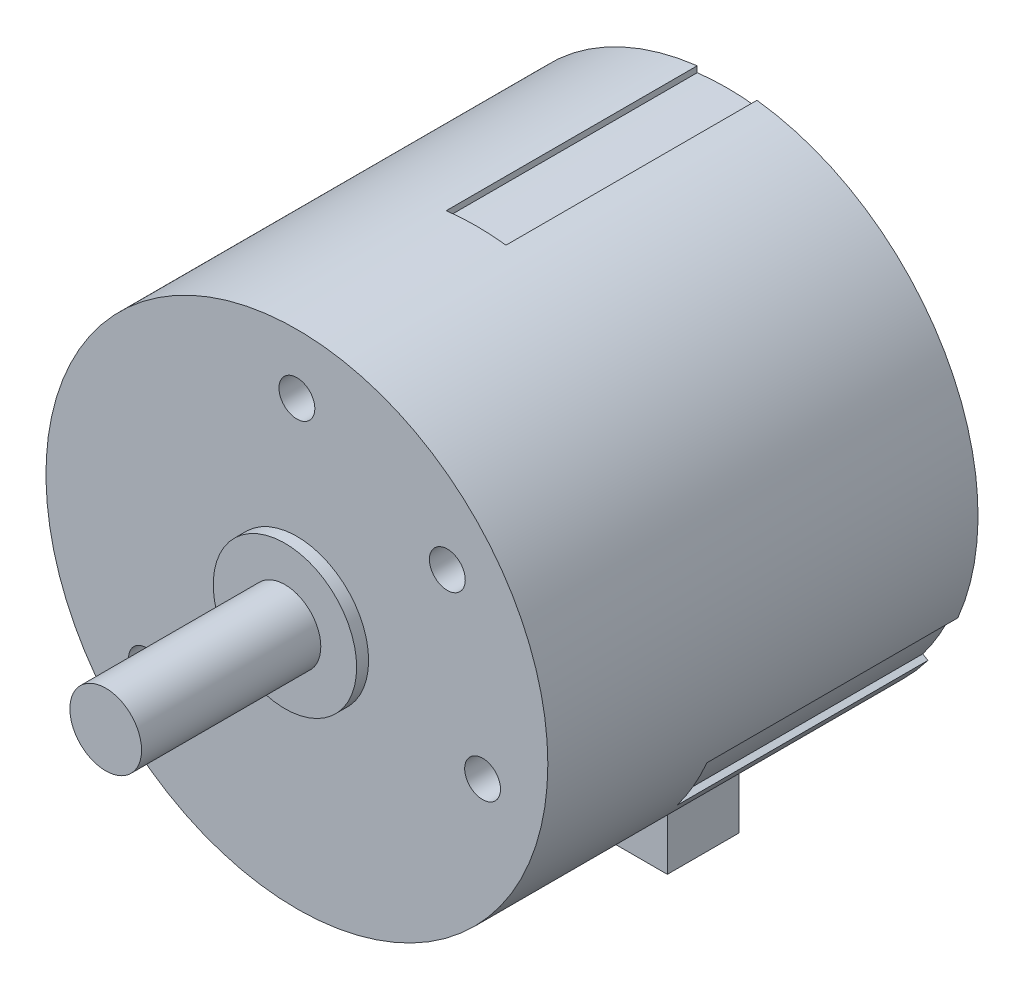
ISO-10303-21;
HEADER;
FILE_DESCRIPTION(('STEP AP214'),'2;1');
FILE_NAME('part.step','',(''),(''),'','','');
FILE_SCHEMA(('AUTOMOTIVE_DESIGN { 1 0 10303 214 1 1 1 1 }'));
ENDSEC;
DATA;
#1=APPLICATION_CONTEXT('core data for automotive mechanical design processes');
#2=APPLICATION_PROTOCOL_DEFINITION('international standard','automotive_design',2000,#1);
#3=PRODUCT_CONTEXT('',#1,'mechanical');
#4=PRODUCT('Part','Part','',(#3));
#5=PRODUCT_RELATED_PRODUCT_CATEGORY('part','',(#4));
#6=PRODUCT_DEFINITION_FORMATION('','',#4);
#7=PRODUCT_DEFINITION_CONTEXT('part definition',#1,'design');
#8=PRODUCT_DEFINITION('design','',#6,#7);
#9=PRODUCT_DEFINITION_SHAPE('','',#8);
#10=(LENGTH_UNIT() NAMED_UNIT(*) SI_UNIT(.MILLI.,.METRE.));
#11=(NAMED_UNIT(*) PLANE_ANGLE_UNIT() SI_UNIT($,.RADIAN.));
#12=(NAMED_UNIT(*) SI_UNIT($,.STERADIAN.) SOLID_ANGLE_UNIT());
#13=UNCERTAINTY_MEASURE_WITH_UNIT(LENGTH_MEASURE(1.E-05),#10,'distance_accuracy_value','');
#14=(GEOMETRIC_REPRESENTATION_CONTEXT(3) GLOBAL_UNCERTAINTY_ASSIGNED_CONTEXT((#13)) GLOBAL_UNIT_ASSIGNED_CONTEXT((#10,
#11,#12)) REPRESENTATION_CONTEXT('',''));
#15=CARTESIAN_POINT('',(0.,0.,0.));
#16=DIRECTION('',(0.,0.,1.));
#17=DIRECTION('',(1.,0.,0.));
#18=AXIS2_PLACEMENT_3D('',#15,#16,#17);
#19=CARTESIAN_POINT('',(0.,0.,0.));
#20=DIRECTION('',(0.,0.,1.));
#21=DIRECTION('',(1.,0.,0.));
#22=AXIS2_PLACEMENT_3D('',#19,#20,#21);
#23=PLANE('',#22);
#24=DIRECTION('',(-0.866025403784439,-0.499999999999999,0.));
#25=VECTOR('',#24,1.);
#26=CARTESIAN_POINT('',(-19.3072007797444,-8.26026622153542,0.));
#27=LINE('',#26,#25);
#28=CARTESIAN_POINT('',(-18.8710101867061,-8.00843146522681,0.));
#29=VERTEX_POINT('',#28);
#30=CARTESIAN_POINT('',(-19.3072007797444,-8.26026622153542,0.));
#31=VERTEX_POINT('',#30);
#32=EDGE_CURVE('E286',#29,#31,#27,.T.);
#33=ORIENTED_EDGE('',*,*,#32,.F.);
#34=CARTESIAN_POINT('',(0.,0.,0.));
#35=DIRECTION('',(0.,0.,-1.));
#36=DIRECTION('',(-1.,0.,0.));
#37=AXIS2_PLACEMENT_3D('',#34,#35,#36);
#38=CIRCLE('',#37,20.5);
#39=CARTESIAN_POINT('',(-16.3710101867061,-12.338558484149,0.));
#40=VERTEX_POINT('',#39);
#41=EDGE_CURVE('E315',#40,#29,#38,.T.);
#42=ORIENTED_EDGE('',*,*,#41,.F.);
#43=DIRECTION('',(0.866025403784439,0.499999999999999,0.));
#44=VECTOR('',#43,1.);
#45=CARTESIAN_POINT('',(-16.8072007797444,-12.5903932404576,0.));
#46=LINE('',#45,#44);
#47=CARTESIAN_POINT('',(-16.8072007797444,-12.5903932404576,0.));
#48=VERTEX_POINT('',#47);
#49=EDGE_CURVE('E312',#48,#40,#46,.T.);
#50=ORIENTED_EDGE('',*,*,#49,.F.);
#51=CARTESIAN_POINT('',(0.,0.,0.));
#52=DIRECTION('',(0.,0.,1.));
#53=DIRECTION('',(1.,0.,0.));
#54=AXIS2_PLACEMENT_3D('',#51,#52,#53);
#55=CIRCLE('',#54,21.);
#56=EDGE_CURVE('E363',#31,#48,#55,.T.);
#57=ORIENTED_EDGE('',*,*,#56,.F.);
#58=EDGE_LOOP('',(#33,#42,#50,#57));
#59=FACE_BOUND('',#58,.T.);
#60=ADVANCED_FACE('F36',(#59),#23,.F.);
#61=DIRECTION('',(0.,-1.,0.));
#62=VECTOR('',#61,1.);
#63=CARTESIAN_POINT('',(-15.,-13.9731886124821,0.));
#64=LINE('',#63,#62);
#65=CARTESIAN_POINT('',(-15.,-13.9731886124821,0.));
#66=VERTEX_POINT('',#65);
#67=CARTESIAN_POINT('',(-15.,-14.6969384566991,0.));
#68=VERTEX_POINT('',#67);
#69=EDGE_CURVE('E309',#66,#68,#64,.T.);
#70=ORIENTED_EDGE('',*,*,#69,.F.);
#71=CARTESIAN_POINT('',(0.,0.,0.));
#72=DIRECTION('',(0.,0.,-1.));
#73=DIRECTION('',(-1.,0.,0.));
#74=AXIS2_PLACEMENT_3D('',#71,#72,#73);
#75=CIRCLE('',#74,20.5);
#76=CARTESIAN_POINT('',(15.,-13.9731886124821,0.));
#77=VERTEX_POINT('',#76);
#78=EDGE_CURVE('E306',#77,#66,#75,.T.);
#79=ORIENTED_EDGE('',*,*,#78,.F.);
#80=DIRECTION('',(0.,1.,0.));
#81=VECTOR('',#80,1.);
#82=CARTESIAN_POINT('',(15.,-13.9731886124821,0.));
#83=LINE('',#82,#81);
#84=CARTESIAN_POINT('',(15.,-14.6969384566991,0.));
#85=VERTEX_POINT('',#84);
#86=EDGE_CURVE('E303',#85,#77,#83,.T.);
#87=ORIENTED_EDGE('',*,*,#86,.F.);
#88=EDGE_CURVE('E365',#68,#85,#55,.T.);
#89=ORIENTED_EDGE('',*,*,#88,.F.);
#90=EDGE_LOOP('',(#70,#79,#87,#89));
#91=FACE_BOUND('',#90,.T.);
#92=ADVANCED_FACE('F386',(#91),#23,.F.);
#93=DIRECTION('',(0.866025403784441,-0.499999999999997,0.));
#94=VECTOR('',#93,1.);
#95=CARTESIAN_POINT('',(16.8072007797443,-12.5903932404576,0.));
#96=LINE('',#95,#94);
#97=CARTESIAN_POINT('',(16.3710101867061,-12.338558484149,0.));
#98=VERTEX_POINT('',#97);
#99=CARTESIAN_POINT('',(16.8072007797443,-12.5903932404576,0.));
#100=VERTEX_POINT('',#99);
#101=EDGE_CURVE('E300',#98,#100,#96,.T.);
#102=ORIENTED_EDGE('',*,*,#101,.F.);
#103=CARTESIAN_POINT('',(0.,0.,0.));
#104=DIRECTION('',(0.,0.,-1.));
#105=DIRECTION('',(-1.,0.,0.));
#106=AXIS2_PLACEMENT_3D('',#103,#104,#105);
#107=CIRCLE('',#106,20.5);
#108=CARTESIAN_POINT('',(18.8710101867061,-8.00843146522682,0.));
#109=VERTEX_POINT('',#108);
#110=EDGE_CURVE('E297',#109,#98,#107,.T.);
#111=ORIENTED_EDGE('',*,*,#110,.F.);
#112=DIRECTION('',(-0.866025403784438,0.500000000000002,0.));
#113=VECTOR('',#112,1.);
#114=CARTESIAN_POINT('',(19.3072007797443,-8.26026622153543,0.));
#115=LINE('',#114,#113);
#116=CARTESIAN_POINT('',(19.3072007797443,-8.26026622153543,0.));
#117=VERTEX_POINT('',#116);
#118=EDGE_CURVE('E294',#117,#109,#115,.T.);
#119=ORIENTED_EDGE('',*,*,#118,.F.);
#120=EDGE_CURVE('E191',#100,#117,#55,.T.);
#121=ORIENTED_EDGE('',*,*,#120,.F.);
#122=EDGE_LOOP('',(#102,#111,#119,#121));
#123=FACE_BOUND('',#122,.T.);
#124=ADVANCED_FACE('F416',(#123),#23,.F.);
#125=DIRECTION('',(0.,1.,0.));
#126=VECTOR('',#125,1.);
#127=CARTESIAN_POINT('',(2.5,20.850659461993,0.));
#128=LINE('',#127,#126);
#129=CARTESIAN_POINT('',(2.5,20.3469899493758,0.));
#130=VERTEX_POINT('',#129);
#131=CARTESIAN_POINT('',(2.5,20.850659461993,0.));
#132=VERTEX_POINT('',#131);
#133=EDGE_CURVE('E291',#130,#132,#128,.T.);
#134=ORIENTED_EDGE('',*,*,#133,.F.);
#135=CARTESIAN_POINT('',(0.,0.,0.));
#136=DIRECTION('',(0.,0.,-1.));
#137=DIRECTION('',(-1.,0.,0.));
#138=AXIS2_PLACEMENT_3D('',#135,#136,#137);
#139=CIRCLE('',#138,20.5);
#140=CARTESIAN_POINT('',(-2.5,20.3469899493758,0.));
#141=VERTEX_POINT('',#140);
#142=EDGE_CURVE('E288',#141,#130,#139,.T.);
#143=ORIENTED_EDGE('',*,*,#142,.F.);
#144=DIRECTION('',(0.,-1.,0.));
#145=VECTOR('',#144,1.);
#146=CARTESIAN_POINT('',(-2.5,20.850659461993,0.));
#147=LINE('',#146,#145);
#148=CARTESIAN_POINT('',(-2.5,20.850659461993,0.));
#149=VERTEX_POINT('',#148);
#150=EDGE_CURVE('E282',#149,#141,#147,.T.);
#151=ORIENTED_EDGE('',*,*,#150,.F.);
#152=EDGE_CURVE('E40',#132,#149,#55,.T.);
#153=ORIENTED_EDGE('',*,*,#152,.F.);
#154=EDGE_LOOP('',(#134,#143,#151,#153));
#155=FACE_BOUND('',#154,.T.);
#156=ADVANCED_FACE('F412',(#155),#23,.F.);
#157=CARTESIAN_POINT('',(0.,0.,15.));
#158=DIRECTION('',(0.,0.,-1.));
#159=DIRECTION('',(-1.,0.,0.));
#160=AXIS2_PLACEMENT_3D('',#157,#158,#159);
#161=CYLINDRICAL_SURFACE('',#160,21.);
#162=DIRECTION('',(0.,0.,1.));
#163=VECTOR('',#162,1.);
#164=CARTESIAN_POINT('',(15.,-14.6969384566991,-6.));
#165=LINE('',#164,#163);
#166=CARTESIAN_POINT('',(15.,-14.6969384566991,-12.));
#167=VERTEX_POINT('',#166);
#168=EDGE_CURVE('E339',#167,#85,#165,.T.);
#169=ORIENTED_EDGE('',*,*,#168,.F.);
#170=CARTESIAN_POINT('',(0.,0.,-12.));
#171=DIRECTION('',(0.,0.,-1.));
#172=DIRECTION('',(-1.,0.,0.));
#173=AXIS2_PLACEMENT_3D('',#170,#171,#172);
#174=CIRCLE('',#173,21.);
#175=CARTESIAN_POINT('',(10.,-18.4661853126194,-12.));
#176=VERTEX_POINT('',#175);
#177=EDGE_CURVE('E208',#167,#176,#174,.T.);
#178=ORIENTED_EDGE('',*,*,#177,.T.);
#179=CARTESIAN_POINT('',(-10.,-18.4661853126194,-12.));
#180=VERTEX_POINT('',#179);
#181=EDGE_CURVE('E60',#176,#180,#174,.T.);
#182=ORIENTED_EDGE('',*,*,#181,.T.);
#183=CARTESIAN_POINT('',(-15.,-14.6969384566991,-12.));
#184=VERTEX_POINT('',#183);
#185=EDGE_CURVE('E211',#180,#184,#174,.T.);
#186=ORIENTED_EDGE('',*,*,#185,.T.);
#187=DIRECTION('',(0.,0.,1.));
#188=VECTOR('',#187,1.);
#189=CARTESIAN_POINT('',(-15.,-14.6969384566991,-6.));
#190=LINE('',#189,#188);
#191=EDGE_CURVE('E330',#184,#68,#190,.T.);
#192=ORIENTED_EDGE('',*,*,#191,.T.);
#193=ORIENTED_EDGE('',*,*,#88,.T.);
#194=EDGE_LOOP('',(#169,#178,#182,#186,#192,#193));
#195=FACE_BOUND('',#194,.T.);
#196=CARTESIAN_POINT('',(0.,0.,15.));
#197=DIRECTION('',(0.,0.,1.));
#198=DIRECTION('',(1.,0.,0.));
#199=AXIS2_PLACEMENT_3D('',#196,#197,#198);
#200=CIRCLE('',#199,21.);
#201=CARTESIAN_POINT('',(21.,0.,15.));
#202=VERTEX_POINT('',#201);
#203=EDGE_CURVE('E359',#202,#202,#200,.T.);
#204=ORIENTED_EDGE('',*,*,#203,.F.);
#205=EDGE_LOOP('',(#204));
#206=FACE_BOUND('',#205,.T.);
#207=ORIENTED_EDGE('',*,*,#152,.T.);
#208=DIRECTION('',(0.,0.,1.));
#209=VECTOR('',#208,1.);
#210=CARTESIAN_POINT('',(-2.5,20.850659461993,-6.));
#211=LINE('',#210,#209);
#212=CARTESIAN_POINT('',(-2.5,20.850659461993,-21.));
#213=VERTEX_POINT('',#212);
#214=EDGE_CURVE('E183',#213,#149,#211,.T.);
#215=ORIENTED_EDGE('',*,*,#214,.F.);
#216=CARTESIAN_POINT('',(0.,0.,-21.));
#217=DIRECTION('',(0.,0.,-1.));
#218=DIRECTION('',(-1.,0.,0.));
#219=AXIS2_PLACEMENT_3D('',#216,#217,#218);
#220=CIRCLE('',#219,21.);
#221=CARTESIAN_POINT('',(-19.3072007797444,-8.26026622153542,-21.));
#222=VERTEX_POINT('',#221);
#223=EDGE_CURVE('E187',#222,#213,#220,.T.);
#224=ORIENTED_EDGE('',*,*,#223,.F.);
#225=DIRECTION('',(0.,0.,1.));
#226=VECTOR('',#225,1.);
#227=CARTESIAN_POINT('',(-19.3072007797444,-8.26026622153542,-6.));
#228=LINE('',#227,#226);
#229=EDGE_CURVE('E285',#222,#31,#228,.T.);
#230=ORIENTED_EDGE('',*,*,#229,.T.);
#231=ORIENTED_EDGE('',*,*,#56,.T.);
#232=DIRECTION('',(0.,0.,1.));
#233=VECTOR('',#232,1.);
#234=CARTESIAN_POINT('',(-16.8072007797444,-12.5903932404576,-6.));
#235=LINE('',#234,#233);
#236=CARTESIAN_POINT('',(-16.8072007797444,-12.5903932404576,-21.));
#237=VERTEX_POINT('',#236);
#238=EDGE_CURVE('E327',#237,#48,#235,.T.);
#239=ORIENTED_EDGE('',*,*,#238,.F.);
#240=CARTESIAN_POINT('',(0.,0.,-21.));
#241=DIRECTION('',(0.,0.,-1.));
#242=DIRECTION('',(-1.,0.,0.));
#243=AXIS2_PLACEMENT_3D('',#240,#241,#242);
#244=CIRCLE('',#243,21.);
#245=CARTESIAN_POINT('',(16.8072007797443,-12.5903932404576,-21.));
#246=VERTEX_POINT('',#245);
#247=EDGE_CURVE('E232',#246,#237,#244,.T.);
#248=ORIENTED_EDGE('',*,*,#247,.F.);
#249=DIRECTION('',(0.,0.,1.));
#250=VECTOR('',#249,1.);
#251=CARTESIAN_POINT('',(16.8072007797443,-12.5903932404576,-6.));
#252=LINE('',#251,#250);
#253=EDGE_CURVE('E342',#246,#100,#252,.T.);
#254=ORIENTED_EDGE('',*,*,#253,.T.);
#255=ORIENTED_EDGE('',*,*,#120,.T.);
#256=DIRECTION('',(0.,0.,1.));
#257=VECTOR('',#256,1.);
#258=CARTESIAN_POINT('',(19.3072007797444,-8.26026622153543,-6.));
#259=LINE('',#258,#257);
#260=CARTESIAN_POINT('',(19.3072007797444,-8.26026622153543,-21.));
#261=VERTEX_POINT('',#260);
#262=EDGE_CURVE('E351',#261,#117,#259,.T.);
#263=ORIENTED_EDGE('',*,*,#262,.F.);
#264=CARTESIAN_POINT('',(0.,0.,-21.));
#265=DIRECTION('',(0.,0.,-1.));
#266=DIRECTION('',(-1.,0.,0.));
#267=AXIS2_PLACEMENT_3D('',#264,#265,#266);
#268=CIRCLE('',#267,21.);
#269=CARTESIAN_POINT('',(2.5,20.850659461993,-21.));
#270=VERTEX_POINT('',#269);
#271=EDGE_CURVE('E220',#270,#261,#268,.T.);
#272=ORIENTED_EDGE('',*,*,#271,.F.);
#273=DIRECTION('',(0.,0.,1.));
#274=VECTOR('',#273,1.);
#275=CARTESIAN_POINT('',(2.5,20.850659461993,-6.));
#276=LINE('',#275,#274);
#277=EDGE_CURVE('E354',#270,#132,#276,.T.);
#278=ORIENTED_EDGE('',*,*,#277,.T.);
#279=EDGE_LOOP('',(#207,#215,#224,#230,#231,#239,#248,#254,#255,#263,#272,#278));
#280=FACE_BOUND('',#279,.T.);
#281=ADVANCED_FACE('F38',(#195,#206,#280),#161,.T.);
#282=CARTESIAN_POINT('',(0.,0.,15.));
#283=DIRECTION('',(0.,0.,1.));
#284=DIRECTION('',(1.,0.,0.));
#285=AXIS2_PLACEMENT_3D('',#282,#283,#284);
#286=PLANE('',#285);
#287=CARTESIAN_POINT('',(0.,16.,15.));
#288=DIRECTION('',(0.,0.,1.));
#289=DIRECTION('',(1.,0.,0.));
#290=AXIS2_PLACEMENT_3D('',#287,#288,#289);
#291=CIRCLE('',#290,1.5);
#292=CARTESIAN_POINT('',(1.5,16.,15.));
#293=VERTEX_POINT('',#292);
#294=EDGE_CURVE('E487',#293,#293,#291,.T.);
#295=ORIENTED_EDGE('',*,*,#294,.F.);
#296=EDGE_LOOP('',(#295));
#297=FACE_BOUND('',#296,.T.);
#298=CARTESIAN_POINT('',(12.5890577486959,9.875,15.));
#299=DIRECTION('',(0.,0.,1.));
#300=DIRECTION('',(1.,0.,0.));
#301=AXIS2_PLACEMENT_3D('',#298,#299,#300);
#302=CIRCLE('',#301,1.5);
#303=CARTESIAN_POINT('',(14.0890577486959,9.875,15.));
#304=VERTEX_POINT('',#303);
#305=EDGE_CURVE('E491',#304,#304,#302,.T.);
#306=ORIENTED_EDGE('',*,*,#305,.F.);
#307=EDGE_LOOP('',(#306));
#308=FACE_BOUND('',#307,.T.);
#309=CARTESIAN_POINT('',(15.5396181585465,-3.810546875,15.));
#310=DIRECTION('',(0.,0.,1.));
#311=DIRECTION('',(1.,0.,0.));
#312=AXIS2_PLACEMENT_3D('',#309,#310,#311);
#313=CIRCLE('',#312,1.5);
#314=CARTESIAN_POINT('',(17.0396181585465,-3.810546875,15.));
#315=VERTEX_POINT('',#314);
#316=EDGE_CURVE('E495',#315,#315,#313,.T.);
#317=ORIENTED_EDGE('',*,*,#316,.F.);
#318=EDGE_LOOP('',(#317));
#319=FACE_BOUND('',#318,.T.);
#320=CARTESIAN_POINT('',(-12.589057748696,-9.87499999999991,15.));
#321=DIRECTION('',(0.,0.,1.));
#322=DIRECTION('',(1.,0.,0.));
#323=AXIS2_PLACEMENT_3D('',#320,#321,#322);
#324=CIRCLE('',#323,1.5);
#325=CARTESIAN_POINT('',(-11.089057748696,-9.87499999999991,15.));
#326=VERTEX_POINT('',#325);
#327=EDGE_CURVE('E499',#326,#326,#324,.T.);
#328=ORIENTED_EDGE('',*,*,#327,.F.);
#329=EDGE_LOOP('',(#328));
#330=FACE_BOUND('',#329,.T.);
#331=CARTESIAN_POINT('',(0.,0.,15.));
#332=DIRECTION('',(0.,0.,1.));
#333=DIRECTION('',(1.,0.,0.));
#334=AXIS2_PLACEMENT_3D('',#331,#332,#333);
#335=CIRCLE('',#334,6.);
#336=CARTESIAN_POINT('',(6.,0.,15.));
#337=VERTEX_POINT('',#336);
#338=EDGE_CURVE('E45',#337,#337,#335,.T.);
#339=ORIENTED_EDGE('',*,*,#338,.F.);
#340=EDGE_LOOP('',(#339));
#341=FACE_BOUND('',#340,.T.);
#342=ORIENTED_EDGE('',*,*,#203,.T.);
#343=EDGE_LOOP('',(#342));
#344=FACE_BOUND('',#343,.T.);
#345=ADVANCED_FACE('F424',(#297,#308,#319,#330,#341,#344),#286,.T.);
#346=CARTESIAN_POINT('',(-2.5,20.850659461993,-6.));
#347=DIRECTION('',(-1.,0.,0.));
#348=DIRECTION('',(0.,0.,1.));
#349=AXIS2_PLACEMENT_3D('',#346,#347,#348);
#350=PLANE('',#349);
#351=ORIENTED_EDGE('',*,*,#150,.T.);
#352=DIRECTION('',(0.,0.,1.));
#353=VECTOR('',#352,1.);
#354=CARTESIAN_POINT('',(-2.5,20.3469899493758,-6.));
#355=LINE('',#354,#353);
#356=CARTESIAN_POINT('',(-2.5,20.3469899493758,-21.));
#357=VERTEX_POINT('',#356);
#358=EDGE_CURVE('E192',#357,#141,#355,.T.);
#359=ORIENTED_EDGE('',*,*,#358,.F.);
#360=DIRECTION('',(0.,-1.,0.));
#361=VECTOR('',#360,1.);
#362=CARTESIAN_POINT('',(-2.5,20.850659461993,-21.));
#363=LINE('',#362,#361);
#364=EDGE_CURVE('E195',#213,#357,#363,.T.);
#365=ORIENTED_EDGE('',*,*,#364,.F.);
#366=ORIENTED_EDGE('',*,*,#214,.T.);
#367=EDGE_LOOP('',(#351,#359,#365,#366));
#368=FACE_BOUND('',#367,.T.);
#369=ADVANCED_FACE('F196',(#368),#350,.F.);
#370=CARTESIAN_POINT('',(0.,0.,-6.));
#371=DIRECTION('',(0.,0.,1.));
#372=DIRECTION('',(1.,0.,0.));
#373=AXIS2_PLACEMENT_3D('',#370,#371,#372);
#374=CYLINDRICAL_SURFACE('',#373,20.5);
#375=ORIENTED_EDGE('',*,*,#142,.T.);
#376=DIRECTION('',(0.,0.,1.));
#377=VECTOR('',#376,1.);
#378=CARTESIAN_POINT('',(2.5,20.3469899493758,-6.));
#379=LINE('',#378,#377);
#380=CARTESIAN_POINT('',(2.5,20.3469899493758,-21.));
#381=VERTEX_POINT('',#380);
#382=EDGE_CURVE('E356',#381,#130,#379,.T.);
#383=ORIENTED_EDGE('',*,*,#382,.F.);
#384=CARTESIAN_POINT('',(0.,0.,-21.));
#385=DIRECTION('',(0.,0.,-1.));
#386=DIRECTION('',(-1.,0.,0.));
#387=AXIS2_PLACEMENT_3D('',#384,#385,#386);
#388=CIRCLE('',#387,20.5);
#389=EDGE_CURVE('E201',#357,#381,#388,.T.);
#390=ORIENTED_EDGE('',*,*,#389,.F.);
#391=ORIENTED_EDGE('',*,*,#358,.T.);
#392=EDGE_LOOP('',(#375,#383,#390,#391));
#393=FACE_BOUND('',#392,.T.);
#394=ADVANCED_FACE('F428',(#393),#374,.T.);
#395=CARTESIAN_POINT('',(2.5,20.850659461993,-6.));
#396=DIRECTION('',(1.,0.,0.));
#397=DIRECTION('',(0.,0.,-1.));
#398=AXIS2_PLACEMENT_3D('',#395,#396,#397);
#399=PLANE('',#398);
#400=ORIENTED_EDGE('',*,*,#133,.T.);
#401=ORIENTED_EDGE('',*,*,#277,.F.);
#402=DIRECTION('',(0.,1.,0.));
#403=VECTOR('',#402,1.);
#404=CARTESIAN_POINT('',(2.5,20.3469899493758,-21.));
#405=LINE('',#404,#403);
#406=EDGE_CURVE('E217',#381,#270,#405,.T.);
#407=ORIENTED_EDGE('',*,*,#406,.F.);
#408=ORIENTED_EDGE('',*,*,#382,.T.);
#409=EDGE_LOOP('',(#400,#401,#407,#408));
#410=FACE_BOUND('',#409,.T.);
#411=ADVANCED_FACE('F430',(#410),#399,.F.);
#412=CARTESIAN_POINT('',(19.3072007797443,-8.26026622153543,-6.));
#413=DIRECTION('',(0.500000000000002,0.866025403784438,0.));
#414=DIRECTION('',(-0.866025403784438,0.500000000000002,0.));
#415=AXIS2_PLACEMENT_3D('',#412,#413,#414);
#416=PLANE('',#415);
#417=ORIENTED_EDGE('',*,*,#118,.T.);
#418=DIRECTION('',(0.,0.,1.));
#419=VECTOR('',#418,1.);
#420=CARTESIAN_POINT('',(18.8710101867061,-8.00843146522682,-6.));
#421=LINE('',#420,#419);
#422=CARTESIAN_POINT('',(18.8710101867061,-8.0084314652268,-21.));
#423=VERTEX_POINT('',#422);
#424=EDGE_CURVE('E348',#423,#109,#421,.T.);
#425=ORIENTED_EDGE('',*,*,#424,.F.);
#426=DIRECTION('',(-0.866025403784434,0.500000000000007,0.));
#427=VECTOR('',#426,1.);
#428=CARTESIAN_POINT('',(19.3072007797444,-8.26026622153543,-21.));
#429=LINE('',#428,#427);
#430=EDGE_CURVE('E223',#261,#423,#429,.T.);
#431=ORIENTED_EDGE('',*,*,#430,.F.);
#432=ORIENTED_EDGE('',*,*,#262,.T.);
#433=EDGE_LOOP('',(#417,#425,#431,#432));
#434=FACE_BOUND('',#433,.T.);
#435=ADVANCED_FACE('F434',(#434),#416,.F.);
#436=CARTESIAN_POINT('',(0.,0.,-6.));
#437=DIRECTION('',(0.,0.,1.));
#438=DIRECTION('',(1.,0.,0.));
#439=AXIS2_PLACEMENT_3D('',#436,#437,#438);
#440=CYLINDRICAL_SURFACE('',#439,20.5);
#441=ORIENTED_EDGE('',*,*,#110,.T.);
#442=DIRECTION('',(0.,0.,1.));
#443=VECTOR('',#442,1.);
#444=CARTESIAN_POINT('',(16.3710101867061,-12.338558484149,-6.));
#445=LINE('',#444,#443);
#446=CARTESIAN_POINT('',(16.3710101867061,-12.338558484149,-21.));
#447=VERTEX_POINT('',#446);
#448=EDGE_CURVE('E345',#447,#98,#445,.T.);
#449=ORIENTED_EDGE('',*,*,#448,.F.);
#450=CARTESIAN_POINT('',(0.,0.,-21.));
#451=DIRECTION('',(0.,0.,-1.));
#452=DIRECTION('',(-1.,0.,0.));
#453=AXIS2_PLACEMENT_3D('',#450,#451,#452);
#454=CIRCLE('',#453,20.5);
#455=EDGE_CURVE('E226',#423,#447,#454,.T.);
#456=ORIENTED_EDGE('',*,*,#455,.F.);
#457=ORIENTED_EDGE('',*,*,#424,.T.);
#458=EDGE_LOOP('',(#441,#449,#456,#457));
#459=FACE_BOUND('',#458,.T.);
#460=ADVANCED_FACE('F438',(#459),#440,.T.);
#461=CARTESIAN_POINT('',(16.8072007797443,-12.5903932404576,-6.));
#462=DIRECTION('',(-0.499999999999997,-0.866025403784441,0.));
#463=DIRECTION('',(0.866025403784441,-0.499999999999997,0.));
#464=AXIS2_PLACEMENT_3D('',#461,#462,#463);
#465=PLANE('',#464);
#466=ORIENTED_EDGE('',*,*,#101,.T.);
#467=ORIENTED_EDGE('',*,*,#253,.F.);
#468=DIRECTION('',(0.866025403784439,-0.5,0.));
#469=VECTOR('',#468,1.);
#470=CARTESIAN_POINT('',(16.3710101867061,-12.338558484149,-21.));
#471=LINE('',#470,#469);
#472=EDGE_CURVE('E229',#447,#246,#471,.T.);
#473=ORIENTED_EDGE('',*,*,#472,.F.);
#474=ORIENTED_EDGE('',*,*,#448,.T.);
#475=EDGE_LOOP('',(#466,#467,#473,#474));
#476=FACE_BOUND('',#475,.T.);
#477=ADVANCED_FACE('F440',(#476),#465,.F.);
#478=CARTESIAN_POINT('',(15.,-13.9731886124821,-6.));
#479=DIRECTION('',(1.,0.,0.));
#480=DIRECTION('',(0.,0.,-1.));
#481=AXIS2_PLACEMENT_3D('',#478,#479,#480);
#482=PLANE('',#481);
#483=ORIENTED_EDGE('',*,*,#86,.T.);
#484=DIRECTION('',(0.,0.,1.));
#485=VECTOR('',#484,1.);
#486=CARTESIAN_POINT('',(15.,-13.9731886124821,-6.));
#487=LINE('',#486,#485);
#488=CARTESIAN_POINT('',(15.,-13.9731886124821,-12.));
#489=VERTEX_POINT('',#488);
#490=EDGE_CURVE('E336',#489,#77,#487,.T.);
#491=ORIENTED_EDGE('',*,*,#490,.F.);
#492=DIRECTION('',(0.,1.,0.));
#493=VECTOR('',#492,1.);
#494=CARTESIAN_POINT('',(15.,-14.6969384566991,-12.));
#495=LINE('',#494,#493);
#496=EDGE_CURVE('E244',#167,#489,#495,.T.);
#497=ORIENTED_EDGE('',*,*,#496,.F.);
#498=ORIENTED_EDGE('',*,*,#168,.T.);
#499=EDGE_LOOP('',(#483,#491,#497,#498));
#500=FACE_BOUND('',#499,.T.);
#501=ADVANCED_FACE('F373',(#500),#482,.F.);
#502=CARTESIAN_POINT('',(0.,0.,-6.));
#503=DIRECTION('',(0.,0.,1.));
#504=DIRECTION('',(1.,0.,0.));
#505=AXIS2_PLACEMENT_3D('',#502,#503,#504);
#506=CYLINDRICAL_SURFACE('',#505,20.5);
#507=ORIENTED_EDGE('',*,*,#78,.T.);
#508=DIRECTION('',(0.,0.,1.));
#509=VECTOR('',#508,1.);
#510=CARTESIAN_POINT('',(-15.,-13.9731886124821,-6.));
#511=LINE('',#510,#509);
#512=CARTESIAN_POINT('',(-15.,-13.9731886124821,-12.));
#513=VERTEX_POINT('',#512);
#514=EDGE_CURVE('E333',#513,#66,#511,.T.);
#515=ORIENTED_EDGE('',*,*,#514,.F.);
#516=CARTESIAN_POINT('',(0.,0.,-12.));
#517=DIRECTION('',(0.,0.,-1.));
#518=DIRECTION('',(-1.,0.,0.));
#519=AXIS2_PLACEMENT_3D('',#516,#517,#518);
#520=CIRCLE('',#519,20.5);
#521=CARTESIAN_POINT('',(-10.,-17.8955301681733,-12.));
#522=VERTEX_POINT('',#521);
#523=EDGE_CURVE('E259',#522,#513,#520,.T.);
#524=ORIENTED_EDGE('',*,*,#523,.F.);
#525=DIRECTION('',(0.,0.,1.));
#526=VECTOR('',#525,1.);
#527=CARTESIAN_POINT('',(-10.,-17.8955301681733,-12.));
#528=LINE('',#527,#526);
#529=CARTESIAN_POINT('',(-10.,-17.8955301681733,-6.));
#530=VERTEX_POINT('',#529);
#531=EDGE_CURVE('E265',#522,#530,#528,.T.);
#532=ORIENTED_EDGE('',*,*,#531,.T.);
#533=CARTESIAN_POINT('',(0.,0.,-6.));
#534=DIRECTION('',(0.,0.,-1.));
#535=DIRECTION('',(-1.,0.,0.));
#536=AXIS2_PLACEMENT_3D('',#533,#534,#535);
#537=CIRCLE('',#536,20.5);
#538=CARTESIAN_POINT('',(10.,-17.8955301681733,-6.));
#539=VERTEX_POINT('',#538);
#540=EDGE_CURVE('E283',#539,#530,#537,.T.);
#541=ORIENTED_EDGE('',*,*,#540,.F.);
#542=DIRECTION('',(0.,0.,1.));
#543=VECTOR('',#542,1.);
#544=CARTESIAN_POINT('',(10.,-17.8955301681733,-12.));
#545=LINE('',#544,#543);
#546=CARTESIAN_POINT('',(10.,-17.8955301681733,-12.));
#547=VERTEX_POINT('',#546);
#548=EDGE_CURVE('E279',#547,#539,#545,.T.);
#549=ORIENTED_EDGE('',*,*,#548,.F.);
#550=CARTESIAN_POINT('',(0.,0.,-12.));
#551=DIRECTION('',(0.,0.,-1.));
#552=DIRECTION('',(-1.,0.,0.));
#553=AXIS2_PLACEMENT_3D('',#550,#551,#552);
#554=CIRCLE('',#553,20.5);
#555=EDGE_CURVE('E247',#489,#547,#554,.T.);
#556=ORIENTED_EDGE('',*,*,#555,.F.);
#557=ORIENTED_EDGE('',*,*,#490,.T.);
#558=EDGE_LOOP('',(#507,#515,#524,#532,#541,#549,#556,#557));
#559=FACE_BOUND('',#558,.T.);
#560=ADVANCED_FACE('F388',(#559),#506,.T.);
#561=CARTESIAN_POINT('',(-15.,-13.9731886124821,-6.));
#562=DIRECTION('',(-1.,0.,0.));
#563=DIRECTION('',(0.,0.,1.));
#564=AXIS2_PLACEMENT_3D('',#561,#562,#563);
#565=PLANE('',#564);
#566=ORIENTED_EDGE('',*,*,#69,.T.);
#567=ORIENTED_EDGE('',*,*,#191,.F.);
#568=DIRECTION('',(0.,-1.,0.));
#569=VECTOR('',#568,1.);
#570=CARTESIAN_POINT('',(-15.,-13.9731886124821,-12.));
#571=LINE('',#570,#569);
#572=EDGE_CURVE('E262',#513,#184,#571,.T.);
#573=ORIENTED_EDGE('',*,*,#572,.F.);
#574=ORIENTED_EDGE('',*,*,#514,.T.);
#575=EDGE_LOOP('',(#566,#567,#573,#574));
#576=FACE_BOUND('',#575,.T.);
#577=ADVANCED_FACE('F385',(#576),#565,.F.);
#578=CARTESIAN_POINT('',(-16.8072007797444,-12.5903932404576,-6.));
#579=DIRECTION('',(0.499999999999999,-0.866025403784439,0.));
#580=DIRECTION('',(0.866025403784439,0.499999999999999,0.));
#581=AXIS2_PLACEMENT_3D('',#578,#579,#580);
#582=PLANE('',#581);
#583=ORIENTED_EDGE('',*,*,#49,.T.);
#584=DIRECTION('',(0.,0.,1.));
#585=VECTOR('',#584,1.);
#586=CARTESIAN_POINT('',(-16.3710101867061,-12.338558484149,-6.));
#587=LINE('',#586,#585);
#588=CARTESIAN_POINT('',(-16.3710101867061,-12.338558484149,-21.));
#589=VERTEX_POINT('',#588);
#590=EDGE_CURVE('E324',#589,#40,#587,.T.);
#591=ORIENTED_EDGE('',*,*,#590,.F.);
#592=DIRECTION('',(0.866025403784439,0.5,0.));
#593=VECTOR('',#592,1.);
#594=CARTESIAN_POINT('',(-16.8072007797444,-12.5903932404576,-21.));
#595=LINE('',#594,#593);
#596=EDGE_CURVE('E235',#237,#589,#595,.T.);
#597=ORIENTED_EDGE('',*,*,#596,.F.);
#598=ORIENTED_EDGE('',*,*,#238,.T.);
#599=EDGE_LOOP('',(#583,#591,#597,#598));
#600=FACE_BOUND('',#599,.T.);
#601=ADVANCED_FACE('F444',(#600),#582,.F.);
#602=CARTESIAN_POINT('',(0.,0.,-6.));
#603=DIRECTION('',(0.,0.,1.));
#604=DIRECTION('',(1.,0.,0.));
#605=AXIS2_PLACEMENT_3D('',#602,#603,#604);
#606=CYLINDRICAL_SURFACE('',#605,20.5);
#607=ORIENTED_EDGE('',*,*,#41,.T.);
#608=DIRECTION('',(0.,0.,1.));
#609=VECTOR('',#608,1.);
#610=CARTESIAN_POINT('',(-18.8710101867061,-8.00843146522681,-6.));
#611=LINE('',#610,#609);
#612=CARTESIAN_POINT('',(-18.8710101867061,-8.0084314652268,-21.));
#613=VERTEX_POINT('',#612);
#614=EDGE_CURVE('E321',#613,#29,#611,.T.);
#615=ORIENTED_EDGE('',*,*,#614,.F.);
#616=CARTESIAN_POINT('',(0.,0.,-21.));
#617=DIRECTION('',(0.,0.,-1.));
#618=DIRECTION('',(-1.,0.,0.));
#619=AXIS2_PLACEMENT_3D('',#616,#617,#618);
#620=CIRCLE('',#619,20.5);
#621=EDGE_CURVE('E238',#589,#613,#620,.T.);
#622=ORIENTED_EDGE('',*,*,#621,.F.);
#623=ORIENTED_EDGE('',*,*,#590,.T.);
#624=EDGE_LOOP('',(#607,#615,#622,#623));
#625=FACE_BOUND('',#624,.T.);
#626=ADVANCED_FACE('F447',(#625),#606,.T.);
#627=CARTESIAN_POINT('',(-19.3072007797444,-8.26026622153542,-6.));
#628=DIRECTION('',(-0.499999999999999,0.866025403784439,0.));
#629=DIRECTION('',(-0.866025403784439,-0.499999999999999,0.));
#630=AXIS2_PLACEMENT_3D('',#627,#628,#629);
#631=PLANE('',#630);
#632=ORIENTED_EDGE('',*,*,#32,.T.);
#633=ORIENTED_EDGE('',*,*,#229,.F.);
#634=DIRECTION('',(-0.866025403784439,-0.499999999999999,0.));
#635=VECTOR('',#634,1.);
#636=CARTESIAN_POINT('',(-18.8710101867061,-8.0084314652268,-21.));
#637=LINE('',#636,#635);
#638=EDGE_CURVE('E207',#613,#222,#637,.T.);
#639=ORIENTED_EDGE('',*,*,#638,.F.);
#640=ORIENTED_EDGE('',*,*,#614,.T.);
#641=EDGE_LOOP('',(#632,#633,#639,#640));
#642=FACE_BOUND('',#641,.T.);
#643=ADVANCED_FACE('F449',(#642),#631,.F.);
#644=CARTESIAN_POINT('',(0.,0.,-6.));
#645=DIRECTION('',(0.,0.,-1.));
#646=DIRECTION('',(-1.,0.,0.));
#647=AXIS2_PLACEMENT_3D('',#644,#645,#646);
#648=PLANE('',#647);
#649=DIRECTION('',(0.,-1.,0.));
#650=VECTOR('',#649,1.);
#651=CARTESIAN_POINT('',(10.,-17.8955301681733,-6.));
#652=LINE('',#651,#650);
#653=CARTESIAN_POINT('',(10.,-24.,-6.));
#654=VERTEX_POINT('',#653);
#655=EDGE_CURVE('E240',#539,#654,#652,.T.);
#656=ORIENTED_EDGE('',*,*,#655,.F.);
#657=ORIENTED_EDGE('',*,*,#540,.T.);
#658=DIRECTION('',(0.,1.,0.));
#659=VECTOR('',#658,1.);
#660=CARTESIAN_POINT('',(-10.,-17.8955301681733,-6.));
#661=LINE('',#660,#659);
#662=CARTESIAN_POINT('',(-10.,-24.,-6.));
#663=VERTEX_POINT('',#662);
#664=EDGE_CURVE('E248',#663,#530,#661,.T.);
#665=ORIENTED_EDGE('',*,*,#664,.F.);
#666=DIRECTION('',(-1.,0.,0.));
#667=VECTOR('',#666,1.);
#668=CARTESIAN_POINT('',(10.,-24.,-6.));
#669=LINE('',#668,#667);
#670=EDGE_CURVE('E267',#654,#663,#669,.T.);
#671=ORIENTED_EDGE('',*,*,#670,.F.);
#672=EDGE_LOOP('',(#656,#657,#665,#671));
#673=FACE_BOUND('',#672,.T.);
#674=ADVANCED_FACE('F451',(#673),#648,.F.);
#675=CARTESIAN_POINT('',(10.,-17.8955301681733,-12.));
#676=DIRECTION('',(-1.,0.,0.));
#677=DIRECTION('',(0.,0.,1.));
#678=AXIS2_PLACEMENT_3D('',#675,#676,#677);
#679=PLANE('',#678);
#680=ORIENTED_EDGE('',*,*,#655,.T.);
#681=DIRECTION('',(0.,0.,1.));
#682=VECTOR('',#681,1.);
#683=CARTESIAN_POINT('',(10.,-24.,-12.));
#684=LINE('',#683,#682);
#685=CARTESIAN_POINT('',(10.,-24.,-12.));
#686=VERTEX_POINT('',#685);
#687=EDGE_CURVE('E276',#686,#654,#684,.T.);
#688=ORIENTED_EDGE('',*,*,#687,.F.);
#689=DIRECTION('',(0.,-1.,0.));
#690=VECTOR('',#689,1.);
#691=CARTESIAN_POINT('',(10.,-17.8955301681733,-12.));
#692=LINE('',#691,#690);
#693=EDGE_CURVE('E251',#176,#686,#692,.T.);
#694=ORIENTED_EDGE('',*,*,#693,.F.);
#695=EDGE_CURVE('E252',#547,#176,#692,.T.);
#696=ORIENTED_EDGE('',*,*,#695,.F.);
#697=ORIENTED_EDGE('',*,*,#548,.T.);
#698=EDGE_LOOP('',(#680,#688,#694,#696,#697));
#699=FACE_BOUND('',#698,.T.);
#700=ADVANCED_FACE('F391',(#699),#679,.F.);
#701=CARTESIAN_POINT('',(10.,-24.,-12.));
#702=DIRECTION('',(0.,1.,0.));
#703=DIRECTION('',(0.,0.,1.));
#704=AXIS2_PLACEMENT_3D('',#701,#702,#703);
#705=PLANE('',#704);
#706=ORIENTED_EDGE('',*,*,#670,.T.);
#707=DIRECTION('',(0.,0.,1.));
#708=VECTOR('',#707,1.);
#709=CARTESIAN_POINT('',(-10.,-24.,-12.));
#710=LINE('',#709,#708);
#711=CARTESIAN_POINT('',(-10.,-24.,-12.));
#712=VERTEX_POINT('',#711);
#713=EDGE_CURVE('E273',#712,#663,#710,.T.);
#714=ORIENTED_EDGE('',*,*,#713,.F.);
#715=DIRECTION('',(-1.,0.,0.));
#716=VECTOR('',#715,1.);
#717=CARTESIAN_POINT('',(10.,-24.,-12.));
#718=LINE('',#717,#716);
#719=EDGE_CURVE('E255',#686,#712,#718,.T.);
#720=ORIENTED_EDGE('',*,*,#719,.F.);
#721=ORIENTED_EDGE('',*,*,#687,.T.);
#722=EDGE_LOOP('',(#706,#714,#720,#721));
#723=FACE_BOUND('',#722,.T.);
#724=ADVANCED_FACE('F397',(#723),#705,.F.);
#725=CARTESIAN_POINT('',(-10.,-17.8955301681733,-12.));
#726=DIRECTION('',(1.,0.,0.));
#727=DIRECTION('',(0.,0.,-1.));
#728=AXIS2_PLACEMENT_3D('',#725,#726,#727);
#729=PLANE('',#728);
#730=ORIENTED_EDGE('',*,*,#664,.T.);
#731=ORIENTED_EDGE('',*,*,#531,.F.);
#732=DIRECTION('',(0.,1.,0.));
#733=VECTOR('',#732,1.);
#734=CARTESIAN_POINT('',(-10.,-17.8955301681733,-12.));
#735=LINE('',#734,#733);
#736=EDGE_CURVE('E53',#180,#522,#735,.T.);
#737=ORIENTED_EDGE('',*,*,#736,.F.);
#738=EDGE_CURVE('E257',#712,#180,#735,.T.);
#739=ORIENTED_EDGE('',*,*,#738,.F.);
#740=ORIENTED_EDGE('',*,*,#713,.T.);
#741=EDGE_LOOP('',(#730,#731,#737,#739,#740));
#742=FACE_BOUND('',#741,.T.);
#743=ADVANCED_FACE('F400',(#742),#729,.F.);
#744=CARTESIAN_POINT('',(0.,0.,-12.));
#745=DIRECTION('',(0.,0.,-1.));
#746=DIRECTION('',(-1.,0.,0.));
#747=AXIS2_PLACEMENT_3D('',#744,#745,#746);
#748=PLANE('',#747);
#749=ORIENTED_EDGE('',*,*,#181,.F.);
#750=ORIENTED_EDGE('',*,*,#693,.T.);
#751=ORIENTED_EDGE('',*,*,#719,.T.);
#752=ORIENTED_EDGE('',*,*,#738,.T.);
#753=EDGE_LOOP('',(#749,#750,#751,#752));
#754=FACE_BOUND('',#753,.T.);
#755=ADVANCED_FACE('F394',(#754),#748,.T.);
#756=CARTESIAN_POINT('',(0.,0.,-12.));
#757=DIRECTION('',(0.,0.,-1.));
#758=DIRECTION('',(-1.,0.,0.));
#759=AXIS2_PLACEMENT_3D('',#756,#757,#758);
#760=PLANE('',#759);
#761=ORIENTED_EDGE('',*,*,#177,.F.);
#762=ORIENTED_EDGE('',*,*,#496,.T.);
#763=ORIENTED_EDGE('',*,*,#555,.T.);
#764=ORIENTED_EDGE('',*,*,#695,.T.);
#765=EDGE_LOOP('',(#761,#762,#763,#764));
#766=FACE_BOUND('',#765,.T.);
#767=ADVANCED_FACE('F377',(#766),#760,.F.);
#768=ORIENTED_EDGE('',*,*,#185,.F.);
#769=ORIENTED_EDGE('',*,*,#736,.T.);
#770=ORIENTED_EDGE('',*,*,#523,.T.);
#771=ORIENTED_EDGE('',*,*,#572,.T.);
#772=EDGE_LOOP('',(#768,#769,#770,#771));
#773=FACE_BOUND('',#772,.T.);
#774=ADVANCED_FACE('F381',(#773),#760,.F.);
#775=CARTESIAN_POINT('',(0.,0.,-21.));
#776=DIRECTION('',(0.,0.,-1.));
#777=DIRECTION('',(-1.,0.,0.));
#778=AXIS2_PLACEMENT_3D('',#775,#776,#777);
#779=PLANE('',#778);
#780=ORIENTED_EDGE('',*,*,#223,.T.);
#781=ORIENTED_EDGE('',*,*,#364,.T.);
#782=ORIENTED_EDGE('',*,*,#389,.T.);
#783=ORIENTED_EDGE('',*,*,#406,.T.);
#784=ORIENTED_EDGE('',*,*,#271,.T.);
#785=ORIENTED_EDGE('',*,*,#430,.T.);
#786=ORIENTED_EDGE('',*,*,#455,.T.);
#787=ORIENTED_EDGE('',*,*,#472,.T.);
#788=ORIENTED_EDGE('',*,*,#247,.T.);
#789=ORIENTED_EDGE('',*,*,#596,.T.);
#790=ORIENTED_EDGE('',*,*,#621,.T.);
#791=ORIENTED_EDGE('',*,*,#638,.T.);
#792=EDGE_LOOP('',(#780,#781,#782,#783,#784,#785,#786,#787,#788,#789,#790,#791));
#793=FACE_BOUND('',#792,.T.);
#794=ADVANCED_FACE('F204',(#793),#779,.T.);
#795=CARTESIAN_POINT('',(0.,0.,16.));
#796=DIRECTION('',(0.,0.,-1.));
#797=DIRECTION('',(-1.,0.,0.));
#798=AXIS2_PLACEMENT_3D('',#795,#796,#797);
#799=CYLINDRICAL_SURFACE('',#798,6.);
#800=CARTESIAN_POINT('',(0.,0.,16.));
#801=DIRECTION('',(0.,0.,1.));
#802=DIRECTION('',(1.,0.,0.));
#803=AXIS2_PLACEMENT_3D('',#800,#801,#802);
#804=CIRCLE('',#803,6.);
#805=CARTESIAN_POINT('',(6.,0.,16.));
#806=VERTEX_POINT('',#805);
#807=EDGE_CURVE('E243',#806,#806,#804,.T.);
#808=ORIENTED_EDGE('',*,*,#807,.F.);
#809=EDGE_LOOP('',(#808));
#810=FACE_BOUND('',#809,.T.);
#811=ORIENTED_EDGE('',*,*,#338,.T.);
#812=EDGE_LOOP('',(#811));
#813=FACE_BOUND('',#812,.T.);
#814=ADVANCED_FACE('F503',(#810,#813),#799,.T.);
#815=CARTESIAN_POINT('',(0.,0.,16.));
#816=DIRECTION('',(0.,0.,1.));
#817=DIRECTION('',(1.,0.,0.));
#818=AXIS2_PLACEMENT_3D('',#815,#816,#817);
#819=PLANE('',#818);
#820=CARTESIAN_POINT('',(0.,0.,16.));
#821=DIRECTION('',(0.,0.,1.));
#822=DIRECTION('',(1.,0.,0.));
#823=AXIS2_PLACEMENT_3D('',#820,#821,#822);
#824=CIRCLE('',#823,3.);
#825=CARTESIAN_POINT('',(3.,0.,16.));
#826=VERTEX_POINT('',#825);
#827=EDGE_CURVE('E11',#826,#826,#824,.T.);
#828=ORIENTED_EDGE('',*,*,#827,.F.);
#829=EDGE_LOOP('',(#828));
#830=FACE_BOUND('',#829,.T.);
#831=ORIENTED_EDGE('',*,*,#807,.T.);
#832=EDGE_LOOP('',(#831));
#833=FACE_BOUND('',#832,.T.);
#834=ADVANCED_FACE('F505',(#830,#833),#819,.T.);
#835=CARTESIAN_POINT('',(0.,0.,31.));
#836=DIRECTION('',(0.,0.,-1.));
#837=DIRECTION('',(-1.,0.,0.));
#838=AXIS2_PLACEMENT_3D('',#835,#836,#837);
#839=CYLINDRICAL_SURFACE('',#838,3.);
#840=CARTESIAN_POINT('',(0.,0.,31.));
#841=DIRECTION('',(0.,0.,1.));
#842=DIRECTION('',(1.,0.,0.));
#843=AXIS2_PLACEMENT_3D('',#840,#841,#842);
#844=CIRCLE('',#843,3.);
#845=CARTESIAN_POINT('',(3.,0.,31.));
#846=VERTEX_POINT('',#845);
#847=EDGE_CURVE('E650',#846,#846,#844,.T.);
#848=ORIENTED_EDGE('',*,*,#847,.F.);
#849=EDGE_LOOP('',(#848));
#850=FACE_BOUND('',#849,.T.);
#851=ORIENTED_EDGE('',*,*,#827,.T.);
#852=EDGE_LOOP('',(#851));
#853=FACE_BOUND('',#852,.T.);
#854=ADVANCED_FACE('F512',(#850,#853),#839,.T.);
#855=CARTESIAN_POINT('',(0.,0.,31.));
#856=DIRECTION('',(0.,0.,1.));
#857=DIRECTION('',(1.,0.,0.));
#858=AXIS2_PLACEMENT_3D('',#855,#856,#857);
#859=PLANE('',#858);
#860=ORIENTED_EDGE('',*,*,#847,.T.);
#861=EDGE_LOOP('',(#860));
#862=FACE_BOUND('',#861,.T.);
#863=ADVANCED_FACE('F548',(#862),#859,.T.);
#864=CARTESIAN_POINT('',(-12.589057748696,-9.87499999999991,12.));
#865=DIRECTION('',(0.,0.,1.));
#866=DIRECTION('',(1.,0.,0.));
#867=AXIS2_PLACEMENT_3D('',#864,#865,#866);
#868=CYLINDRICAL_SURFACE('',#867,1.5);
#869=CARTESIAN_POINT('',(-12.589057748696,-9.87499999999991,12.));
#870=DIRECTION('',(0.,0.,1.));
#871=DIRECTION('',(1.,0.,0.));
#872=AXIS2_PLACEMENT_3D('',#869,#870,#871);
#873=CIRCLE('',#872,1.5);
#874=CARTESIAN_POINT('',(-11.089057748696,-9.87499999999991,12.));
#875=VERTEX_POINT('',#874);
#876=EDGE_CURVE('E664',#875,#875,#873,.T.);
#877=ORIENTED_EDGE('',*,*,#876,.F.);
#878=EDGE_LOOP('',(#877));
#879=FACE_BOUND('',#878,.T.);
#880=ORIENTED_EDGE('',*,*,#327,.T.);
#881=EDGE_LOOP('',(#880));
#882=FACE_BOUND('',#881,.T.);
#883=ADVANCED_FACE('F556',(#879,#882),#868,.F.);
#884=CARTESIAN_POINT('',(-12.589057748696,-9.87499999999991,12.));
#885=DIRECTION('',(0.,0.,1.));
#886=DIRECTION('',(1.,0.,0.));
#887=AXIS2_PLACEMENT_3D('',#884,#885,#886);
#888=PLANE('',#887);
#889=ORIENTED_EDGE('',*,*,#876,.T.);
#890=EDGE_LOOP('',(#889));
#891=FACE_BOUND('',#890,.T.);
#892=ADVANCED_FACE('F573',(#891),#888,.T.);
#893=CARTESIAN_POINT('',(15.5396181585465,-3.810546875,12.));
#894=DIRECTION('',(0.,0.,1.));
#895=DIRECTION('',(1.,0.,0.));
#896=AXIS2_PLACEMENT_3D('',#893,#894,#895);
#897=CYLINDRICAL_SURFACE('',#896,1.5);
#898=CARTESIAN_POINT('',(15.5396181585465,-3.810546875,12.));
#899=DIRECTION('',(0.,0.,1.));
#900=DIRECTION('',(1.,0.,0.));
#901=AXIS2_PLACEMENT_3D('',#898,#899,#900);
#902=CIRCLE('',#901,1.5);
#903=CARTESIAN_POINT('',(17.0396181585465,-3.810546875,12.));
#904=VERTEX_POINT('',#903);
#905=EDGE_CURVE('E660',#904,#904,#902,.T.);
#906=ORIENTED_EDGE('',*,*,#905,.F.);
#907=EDGE_LOOP('',(#906));
#908=FACE_BOUND('',#907,.T.);
#909=ORIENTED_EDGE('',*,*,#316,.T.);
#910=EDGE_LOOP('',(#909));
#911=FACE_BOUND('',#910,.T.);
#912=ADVANCED_FACE('F583',(#908,#911),#897,.F.);
#913=CARTESIAN_POINT('',(15.5396181585465,-3.810546875,12.));
#914=DIRECTION('',(0.,0.,1.));
#915=DIRECTION('',(1.,0.,0.));
#916=AXIS2_PLACEMENT_3D('',#913,#914,#915);
#917=PLANE('',#916);
#918=ORIENTED_EDGE('',*,*,#905,.T.);
#919=EDGE_LOOP('',(#918));
#920=FACE_BOUND('',#919,.T.);
#921=ADVANCED_FACE('F593',(#920),#917,.T.);
#922=CARTESIAN_POINT('',(12.5890577486959,9.875,12.));
#923=DIRECTION('',(0.,0.,1.));
#924=DIRECTION('',(1.,0.,0.));
#925=AXIS2_PLACEMENT_3D('',#922,#923,#924);
#926=CYLINDRICAL_SURFACE('',#925,1.5);
#927=CARTESIAN_POINT('',(12.5890577486959,9.875,12.));
#928=DIRECTION('',(0.,0.,1.));
#929=DIRECTION('',(1.,0.,0.));
#930=AXIS2_PLACEMENT_3D('',#927,#928,#929);
#931=CIRCLE('',#930,1.5);
#932=CARTESIAN_POINT('',(14.0890577486959,9.875,12.));
#933=VERTEX_POINT('',#932);
#934=EDGE_CURVE('E654',#933,#933,#931,.T.);
#935=ORIENTED_EDGE('',*,*,#934,.F.);
#936=EDGE_LOOP('',(#935));
#937=FACE_BOUND('',#936,.T.);
#938=ORIENTED_EDGE('',*,*,#305,.T.);
#939=EDGE_LOOP('',(#938));
#940=FACE_BOUND('',#939,.T.);
#941=ADVANCED_FACE('F603',(#937,#940),#926,.F.);
#942=CARTESIAN_POINT('',(12.5890577486959,9.875,12.));
#943=DIRECTION('',(0.,0.,1.));
#944=DIRECTION('',(1.,0.,0.));
#945=AXIS2_PLACEMENT_3D('',#942,#943,#944);
#946=PLANE('',#945);
#947=ORIENTED_EDGE('',*,*,#934,.T.);
#948=EDGE_LOOP('',(#947));
#949=FACE_BOUND('',#948,.T.);
#950=ADVANCED_FACE('F613',(#949),#946,.T.);
#951=CARTESIAN_POINT('',(0.,16.,12.));
#952=DIRECTION('',(0.,0.,1.));
#953=DIRECTION('',(1.,0.,0.));
#954=AXIS2_PLACEMENT_3D('',#951,#952,#953);
#955=CYLINDRICAL_SURFACE('',#954,1.5);
#956=CARTESIAN_POINT('',(0.,16.,12.));
#957=DIRECTION('',(0.,0.,1.));
#958=DIRECTION('',(1.,0.,0.));
#959=AXIS2_PLACEMENT_3D('',#956,#957,#958);
#960=CIRCLE('',#959,1.5);
#961=CARTESIAN_POINT('',(1.5,16.,12.));
#962=VERTEX_POINT('',#961);
#963=EDGE_CURVE('E649',#962,#962,#960,.T.);
#964=ORIENTED_EDGE('',*,*,#963,.F.);
#965=EDGE_LOOP('',(#964));
#966=FACE_BOUND('',#965,.T.);
#967=ORIENTED_EDGE('',*,*,#294,.T.);
#968=EDGE_LOOP('',(#967));
#969=FACE_BOUND('',#968,.T.);
#970=ADVANCED_FACE('F623',(#966,#969),#955,.F.);
#971=CARTESIAN_POINT('',(0.,16.,12.));
#972=DIRECTION('',(0.,0.,1.));
#973=DIRECTION('',(1.,0.,0.));
#974=AXIS2_PLACEMENT_3D('',#971,#972,#973);
#975=PLANE('',#974);
#976=ORIENTED_EDGE('',*,*,#963,.T.);
#977=EDGE_LOOP('',(#976));
#978=FACE_BOUND('',#977,.T.);
#979=ADVANCED_FACE('F633',(#978),#975,.T.);
#980=CLOSED_SHELL('',(#60,#92,#124,#156,#281,#345,#369,#394,#411,#435,#460,#477,#501,#560,#577,
#601,#626,#643,#674,#700,#724,#743,#755,#767,#774,#794,#814,#834,#854,#863,#883,#892,#912,#921,
#941,#950,#970,#979));
#981=MANIFOLD_SOLID_BREP('B2',#980);
#982=ADVANCED_BREP_SHAPE_REPRESENTATION('',(#18,#981),#14);
#983=SHAPE_DEFINITION_REPRESENTATION(#9,#982);
ENDSEC;
END-ISO-10303-21;
